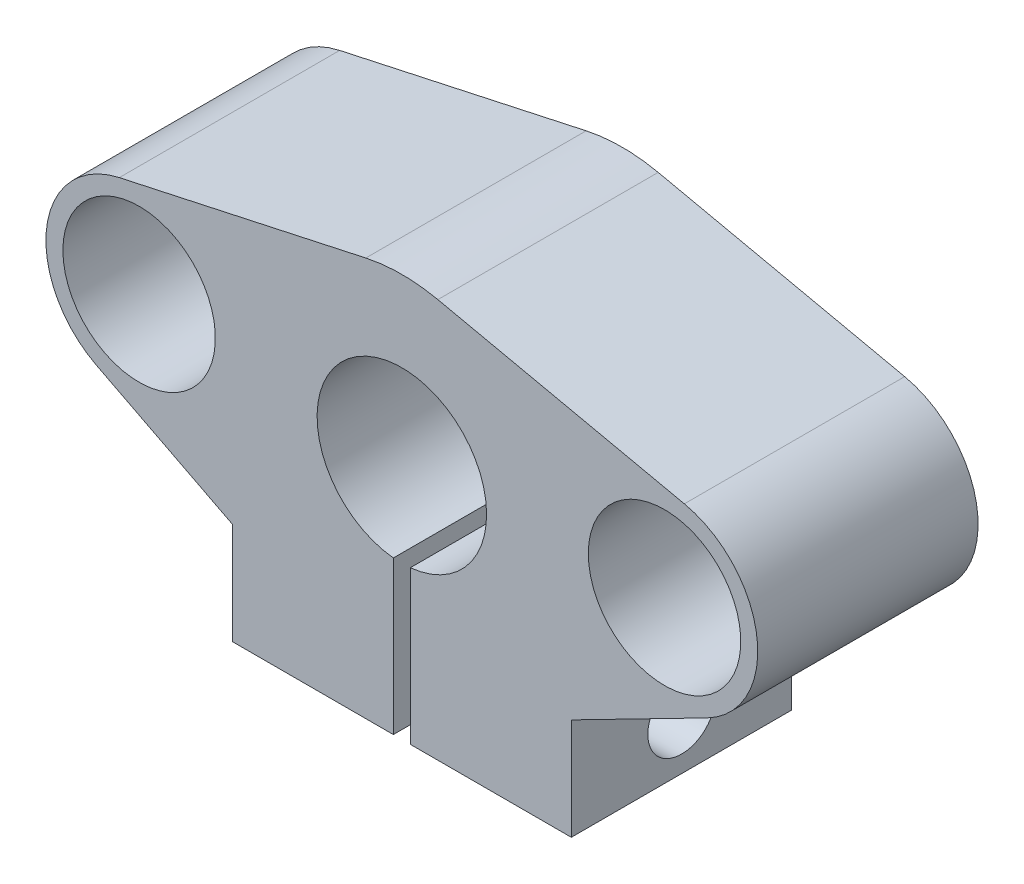
ISO-10303-21;
HEADER;
FILE_DESCRIPTION(('STEP AP214'),'2;1');
FILE_NAME('part.step','',(''),(''),'','','');
FILE_SCHEMA(('AUTOMOTIVE_DESIGN { 1 0 10303 214 1 1 1 1 }'));
ENDSEC;
DATA;
#1=APPLICATION_CONTEXT('core data for automotive mechanical design processes');
#2=APPLICATION_PROTOCOL_DEFINITION('international standard','automotive_design',2000,#1);
#3=PRODUCT_CONTEXT('',#1,'mechanical');
#4=PRODUCT('Part','Part','',(#3));
#5=PRODUCT_RELATED_PRODUCT_CATEGORY('part','',(#4));
#6=PRODUCT_DEFINITION_FORMATION('','',#4);
#7=PRODUCT_DEFINITION_CONTEXT('part definition',#1,'design');
#8=PRODUCT_DEFINITION('design','',#6,#7);
#9=PRODUCT_DEFINITION_SHAPE('','',#8);
#10=(LENGTH_UNIT() NAMED_UNIT(*) SI_UNIT(.MILLI.,.METRE.));
#11=(NAMED_UNIT(*) PLANE_ANGLE_UNIT() SI_UNIT($,.RADIAN.));
#12=(NAMED_UNIT(*) SI_UNIT($,.STERADIAN.) SOLID_ANGLE_UNIT());
#13=UNCERTAINTY_MEASURE_WITH_UNIT(LENGTH_MEASURE(1.E-05),#10,'distance_accuracy_value','');
#14=(GEOMETRIC_REPRESENTATION_CONTEXT(3) GLOBAL_UNCERTAINTY_ASSIGNED_CONTEXT((#13)) GLOBAL_UNIT_ASSIGNED_CONTEXT((#10,
#11,#12)) REPRESENTATION_CONTEXT('',''));
#15=CARTESIAN_POINT('',(0.,0.,0.));
#16=DIRECTION('',(0.,0.,1.));
#17=DIRECTION('',(1.,0.,0.));
#18=AXIS2_PLACEMENT_3D('',#15,#16,#17);
#19=CARTESIAN_POINT('',(0.,-12.,13.));
#20=DIRECTION('',(0.,1.,0.));
#21=DIRECTION('',(0.,0.,1.));
#22=AXIS2_PLACEMENT_3D('',#19,#20,#21);
#23=PLANE('',#22);
#24=DIRECTION('',(1.,0.,0.));
#25=VECTOR('',#24,1.);
#26=CARTESIAN_POINT('',(0.,-12.,0.));
#27=LINE('',#26,#25);
#28=CARTESIAN_POINT('',(-9.9999810136796,-12.,0.));
#29=VERTEX_POINT('',#28);
#30=CARTESIAN_POINT('',(-0.5,-12.,0.));
#31=VERTEX_POINT('',#30);
#32=EDGE_CURVE('E165',#29,#31,#27,.T.);
#33=ORIENTED_EDGE('',*,*,#32,.T.);
#34=DIRECTION('',(0.,0.,-1.));
#35=VECTOR('',#34,1.);
#36=CARTESIAN_POINT('',(-0.5,-12.,13.));
#37=LINE('',#36,#35);
#38=CARTESIAN_POINT('',(-0.5,-12.,13.));
#39=VERTEX_POINT('',#38);
#40=EDGE_CURVE('E158',#39,#31,#37,.T.);
#41=ORIENTED_EDGE('',*,*,#40,.F.);
#42=DIRECTION('',(1.,0.,0.));
#43=VECTOR('',#42,1.);
#44=CARTESIAN_POINT('',(0.,-12.,13.));
#45=LINE('',#44,#43);
#46=CARTESIAN_POINT('',(-9.9999810136796,-12.,13.));
#47=VERTEX_POINT('',#46);
#48=EDGE_CURVE('E265',#47,#39,#45,.T.);
#49=ORIENTED_EDGE('',*,*,#48,.F.);
#50=DIRECTION('',(0.,0.,-1.));
#51=VECTOR('',#50,1.);
#52=CARTESIAN_POINT('',(-9.9999810136796,-12.,13.));
#53=LINE('',#52,#51);
#54=EDGE_CURVE('E203',#47,#29,#53,.T.);
#55=ORIENTED_EDGE('',*,*,#54,.T.);
#56=EDGE_LOOP('',(#33,#41,#49,#55));
#57=FACE_BOUND('',#56,.T.);
#58=ADVANCED_FACE('F39',(#57),#23,.F.);
#59=CARTESIAN_POINT('',(21.,-8.999981481112,6.48790074393446));
#60=DIRECTION('',(-1.,0.,0.));
#61=DIRECTION('',(0.,0.,1.));
#62=AXIS2_PLACEMENT_3D('',#59,#60,#61);
#63=CYLINDRICAL_SURFACE('',#62,2.);
#64=CARTESIAN_POINT('',(-0.5,-8.999981481112,6.48790074393446));
#65=DIRECTION('',(-1.,0.,0.));
#66=DIRECTION('',(0.,0.,1.));
#67=AXIS2_PLACEMENT_3D('',#64,#65,#66);
#68=CIRCLE('',#67,2.);
#69=CARTESIAN_POINT('',(-0.500000000000001,-8.999981481112,8.48790074393446));
#70=VERTEX_POINT('',#69);
#71=EDGE_CURVE('E222',#70,#70,#68,.F.);
#72=ORIENTED_EDGE('',*,*,#71,.T.);
#73=EDGE_LOOP('',(#72));
#74=FACE_BOUND('',#73,.T.);
#75=CARTESIAN_POINT('',(-9.9999810136796,-8.999981481112,6.48790074393446));
#76=DIRECTION('',(-1.,0.,0.));
#77=DIRECTION('',(0.,0.,1.));
#78=AXIS2_PLACEMENT_3D('',#75,#76,#77);
#79=CIRCLE('',#78,2.);
#80=CARTESIAN_POINT('',(-9.9999810136796,-8.999981481112,8.48790074393446));
#81=VERTEX_POINT('',#80);
#82=EDGE_CURVE('E217',#81,#81,#79,.T.);
#83=ORIENTED_EDGE('',*,*,#82,.T.);
#84=EDGE_LOOP('',(#83));
#85=FACE_BOUND('',#84,.T.);
#86=ADVANCED_FACE('F305',(#74,#85),#63,.F.);
#87=CARTESIAN_POINT('',(-2.49220840305511,11.4579205999851,13.));
#88=DIRECTION('',(0.212540074655527,-0.977152350795629,0.));
#89=DIRECTION('',(0.977152350795629,0.212540074655527,0.));
#90=AXIS2_PLACEMENT_3D('',#87,#88,#89);
#91=PLANE('',#90);
#92=DIRECTION('',(-0.977152350795629,-0.212540074655527,0.));
#93=VECTOR('',#92,1.);
#94=CARTESIAN_POINT('',(-2.49220840305511,11.4579205999851,13.));
#95=LINE('',#94,#93);
#96=CARTESIAN_POINT('',(-2.12540074655527,11.5377048082851,13.));
#97=VERTEX_POINT('',#96);
#98=CARTESIAN_POINT('',(-16.6689704106054,8.37433792937596,13.));
#99=VERTEX_POINT('',#98);
#100=EDGE_CURVE('E190',#97,#99,#95,.T.);
#101=ORIENTED_EDGE('',*,*,#100,.F.);
#102=DIRECTION('',(0.,0.,-1.));
#103=VECTOR('',#102,1.);
#104=CARTESIAN_POINT('',(-2.12540074655527,11.5377048082851,0.));
#105=LINE('',#104,#103);
#106=CARTESIAN_POINT('',(-2.12540074655527,11.5377048082851,0.));
#107=VERTEX_POINT('',#106);
#108=EDGE_CURVE('E212',#97,#107,#105,.T.);
#109=ORIENTED_EDGE('',*,*,#108,.T.);
#110=DIRECTION('',(-0.977152350795629,-0.212540074655527,0.));
#111=VECTOR('',#110,1.);
#112=CARTESIAN_POINT('',(-2.49220840305511,11.4579205999851,0.));
#113=LINE('',#112,#111);
#114=CARTESIAN_POINT('',(-16.6689704106054,8.37433792937596,0.));
#115=VERTEX_POINT('',#114);
#116=EDGE_CURVE('E216',#107,#115,#113,.T.);
#117=ORIENTED_EDGE('',*,*,#116,.T.);
#118=DIRECTION('',(0.,0.,-1.));
#119=VECTOR('',#118,1.);
#120=CARTESIAN_POINT('',(-16.6689704106054,8.37433792937596,13.));
#121=LINE('',#120,#119);
#122=EDGE_CURVE('E209',#99,#115,#121,.T.);
#123=ORIENTED_EDGE('',*,*,#122,.F.);
#124=EDGE_LOOP('',(#101,#109,#117,#123));
#125=FACE_BOUND('',#124,.T.);
#126=ADVANCED_FACE('F231',(#125),#91,.F.);
#127=CARTESIAN_POINT('',(-15.5,3.,13.));
#128=DIRECTION('',(0.,0.,-1.));
#129=DIRECTION('',(-1.,0.,0.));
#130=AXIS2_PLACEMENT_3D('',#127,#128,#129);
#131=CYLINDRICAL_SURFACE('',#130,5.5);
#132=CARTESIAN_POINT('',(-15.5,3.,0.));
#133=DIRECTION('',(0.,0.,1.));
#134=DIRECTION('',(1.,0.,0.));
#135=AXIS2_PLACEMENT_3D('',#132,#133,#134);
#136=CIRCLE('',#135,5.5);
#137=CARTESIAN_POINT('',(-18.0089661298433,-1.89439362529199,0.));
#138=VERTEX_POINT('',#137);
#139=EDGE_CURVE('E238',#115,#138,#136,.T.);
#140=ORIENTED_EDGE('',*,*,#139,.T.);
#141=DIRECTION('',(0.,0.,-1.));
#142=VECTOR('',#141,1.);
#143=CARTESIAN_POINT('',(-18.0089661298433,-1.89439362529199,13.));
#144=LINE('',#143,#142);
#145=CARTESIAN_POINT('',(-18.0089661298433,-1.89439362529199,13.));
#146=VERTEX_POINT('',#145);
#147=EDGE_CURVE('E207',#146,#138,#144,.T.);
#148=ORIENTED_EDGE('',*,*,#147,.F.);
#149=CARTESIAN_POINT('',(-15.5,3.,13.));
#150=DIRECTION('',(0.,0.,1.));
#151=DIRECTION('',(1.,0.,0.));
#152=AXIS2_PLACEMENT_3D('',#149,#150,#151);
#153=CIRCLE('',#152,5.5);
#154=EDGE_CURVE('E255',#99,#146,#153,.T.);
#155=ORIENTED_EDGE('',*,*,#154,.F.);
#156=ORIENTED_EDGE('',*,*,#122,.T.);
#157=EDGE_LOOP('',(#140,#148,#155,#156));
#158=FACE_BOUND('',#157,.T.);
#159=ADVANCED_FACE('F254',(#158),#131,.T.);
#160=CARTESIAN_POINT('',(-4.51661960537823,-8.81084600604487,13.));
#161=DIRECTION('',(-0.456175659971517,-0.88988975005309,0.));
#162=DIRECTION('',(0.88988975005309,-0.456175659971517,0.));
#163=AXIS2_PLACEMENT_3D('',#160,#161,#162);
#164=PLANE('',#163);
#165=DIRECTION('',(-0.88988975005309,0.456175659971517,0.));
#166=VECTOR('',#165,1.);
#167=CARTESIAN_POINT('',(-4.51661960537823,-8.81084600604487,0.));
#168=LINE('',#167,#166);
#169=CARTESIAN_POINT('',(-9.9999810136796,-5.999962962224,0.));
#170=VERTEX_POINT('',#169);
#171=EDGE_CURVE('E170',#170,#138,#168,.T.);
#172=ORIENTED_EDGE('',*,*,#171,.F.);
#173=DIRECTION('',(0.,0.,-1.));
#174=VECTOR('',#173,1.);
#175=CARTESIAN_POINT('',(-9.9999810136796,-5.999962962224,13.));
#176=LINE('',#175,#174);
#177=CARTESIAN_POINT('',(-9.9999810136796,-5.999962962224,13.));
#178=VERTEX_POINT('',#177);
#179=EDGE_CURVE('E205',#178,#170,#176,.T.);
#180=ORIENTED_EDGE('',*,*,#179,.F.);
#181=DIRECTION('',(-0.88988975005309,0.456175659971517,0.));
#182=VECTOR('',#181,1.);
#183=CARTESIAN_POINT('',(-4.51661960537823,-8.81084600604487,13.));
#184=LINE('',#183,#182);
#185=EDGE_CURVE('E251',#178,#146,#184,.T.);
#186=ORIENTED_EDGE('',*,*,#185,.T.);
#187=ORIENTED_EDGE('',*,*,#147,.T.);
#188=EDGE_LOOP('',(#172,#180,#186,#187));
#189=FACE_BOUND('',#188,.T.);
#190=ADVANCED_FACE('F247',(#189),#164,.T.);
#191=CARTESIAN_POINT('',(-9.9999810136796,0.,13.));
#192=DIRECTION('',(-1.,0.,0.));
#193=DIRECTION('',(0.,0.,1.));
#194=AXIS2_PLACEMENT_3D('',#191,#192,#193);
#195=PLANE('',#194);
#196=ORIENTED_EDGE('',*,*,#82,.F.);
#197=EDGE_LOOP('',(#196));
#198=FACE_BOUND('',#197,.T.);
#199=DIRECTION('',(0.,1.,0.));
#200=VECTOR('',#199,1.);
#201=CARTESIAN_POINT('',(-9.9999810136796,0.,0.));
#202=LINE('',#201,#200);
#203=EDGE_CURVE('E166',#29,#170,#202,.T.);
#204=ORIENTED_EDGE('',*,*,#203,.F.);
#205=ORIENTED_EDGE('',*,*,#54,.F.);
#206=DIRECTION('',(0.,1.,0.));
#207=VECTOR('',#206,1.);
#208=CARTESIAN_POINT('',(-9.9999810136796,0.,13.));
#209=LINE('',#208,#207);
#210=EDGE_CURVE('E258',#47,#178,#209,.T.);
#211=ORIENTED_EDGE('',*,*,#210,.T.);
#212=ORIENTED_EDGE('',*,*,#179,.T.);
#213=EDGE_LOOP('',(#204,#205,#211,#212));
#214=FACE_BOUND('',#213,.T.);
#215=ADVANCED_FACE('F307',(#198,#214),#195,.T.);
#216=CARTESIAN_POINT('',(0.5,-12.,13.));
#217=VERTEX_POINT('',#216);
#218=CARTESIAN_POINT('',(9.9999810136796,-12.,13.));
#219=VERTEX_POINT('',#218);
#220=EDGE_CURVE('E157',#217,#219,#45,.T.);
#221=ORIENTED_EDGE('',*,*,#220,.F.);
#222=DIRECTION('',(0.,0.,1.));
#223=VECTOR('',#222,1.);
#224=CARTESIAN_POINT('',(0.5,-12.,13.));
#225=LINE('',#224,#223);
#226=CARTESIAN_POINT('',(0.499999999999999,-12.,0.));
#227=VERTEX_POINT('',#226);
#228=EDGE_CURVE('E141',#227,#217,#225,.T.);
#229=ORIENTED_EDGE('',*,*,#228,.F.);
#230=CARTESIAN_POINT('',(9.9999810136796,-12.,0.));
#231=VERTEX_POINT('',#230);
#232=EDGE_CURVE('E155',#227,#231,#27,.T.);
#233=ORIENTED_EDGE('',*,*,#232,.T.);
#234=DIRECTION('',(0.,0.,-1.));
#235=VECTOR('',#234,1.);
#236=CARTESIAN_POINT('',(9.9999810136796,-12.,13.));
#237=LINE('',#236,#235);
#238=EDGE_CURVE('E201',#219,#231,#237,.T.);
#239=ORIENTED_EDGE('',*,*,#238,.F.);
#240=EDGE_LOOP('',(#221,#229,#233,#239));
#241=FACE_BOUND('',#240,.T.);
#242=ADVANCED_FACE('F153',(#241),#23,.F.);
#243=CARTESIAN_POINT('',(9.9999810136796,0.,13.));
#244=DIRECTION('',(-1.,0.,0.));
#245=DIRECTION('',(0.,0.,1.));
#246=AXIS2_PLACEMENT_3D('',#243,#244,#245);
#247=PLANE('',#246);
#248=CARTESIAN_POINT('',(9.9999810136796,-8.999981481112,6.48790074393446));
#249=DIRECTION('',(-1.,0.,0.));
#250=DIRECTION('',(0.,0.,1.));
#251=AXIS2_PLACEMENT_3D('',#248,#249,#250);
#252=CIRCLE('',#251,2.);
#253=CARTESIAN_POINT('',(9.9999810136796,-8.999981481112,8.48790074393446));
#254=VERTEX_POINT('',#253);
#255=EDGE_CURVE('E213',#254,#254,#252,.T.);
#256=ORIENTED_EDGE('',*,*,#255,.T.);
#257=EDGE_LOOP('',(#256));
#258=FACE_BOUND('',#257,.T.);
#259=DIRECTION('',(0.,1.,0.));
#260=VECTOR('',#259,1.);
#261=CARTESIAN_POINT('',(9.9999810136796,0.,0.));
#262=LINE('',#261,#260);
#263=CARTESIAN_POINT('',(9.9999810136796,-5.999962962224,0.));
#264=VERTEX_POINT('',#263);
#265=EDGE_CURVE('E164',#231,#264,#262,.T.);
#266=ORIENTED_EDGE('',*,*,#265,.T.);
#267=DIRECTION('',(0.,0.,-1.));
#268=VECTOR('',#267,1.);
#269=CARTESIAN_POINT('',(9.9999810136796,-5.999962962224,13.));
#270=LINE('',#269,#268);
#271=CARTESIAN_POINT('',(9.9999810136796,-5.999962962224,13.));
#272=VERTEX_POINT('',#271);
#273=EDGE_CURVE('E198',#272,#264,#270,.T.);
#274=ORIENTED_EDGE('',*,*,#273,.F.);
#275=DIRECTION('',(0.,1.,0.));
#276=VECTOR('',#275,1.);
#277=CARTESIAN_POINT('',(9.9999810136796,0.,13.));
#278=LINE('',#277,#276);
#279=EDGE_CURVE('E268',#219,#272,#278,.T.);
#280=ORIENTED_EDGE('',*,*,#279,.F.);
#281=ORIENTED_EDGE('',*,*,#238,.T.);
#282=EDGE_LOOP('',(#266,#274,#280,#281));
#283=FACE_BOUND('',#282,.T.);
#284=ADVANCED_FACE('F339',(#258,#283),#247,.F.);
#285=CARTESIAN_POINT('',(4.51661960537823,-8.81084600604487,13.));
#286=DIRECTION('',(-0.456175659971517,0.88988975005309,0.));
#287=DIRECTION('',(-0.88988975005309,-0.456175659971517,0.));
#288=AXIS2_PLACEMENT_3D('',#285,#286,#287);
#289=PLANE('',#288);
#290=DIRECTION('',(0.88988975005309,0.456175659971517,0.));
#291=VECTOR('',#290,1.);
#292=CARTESIAN_POINT('',(4.51661960537823,-8.81084600604487,0.));
#293=LINE('',#292,#291);
#294=CARTESIAN_POINT('',(18.0089661298433,-1.894393625292,0.));
#295=VERTEX_POINT('',#294);
#296=EDGE_CURVE('E175',#264,#295,#293,.T.);
#297=ORIENTED_EDGE('',*,*,#296,.T.);
#298=DIRECTION('',(0.,0.,-1.));
#299=VECTOR('',#298,1.);
#300=CARTESIAN_POINT('',(18.0089661298433,-1.894393625292,13.));
#301=LINE('',#300,#299);
#302=CARTESIAN_POINT('',(18.0089661298433,-1.894393625292,13.));
#303=VERTEX_POINT('',#302);
#304=EDGE_CURVE('E194',#303,#295,#301,.T.);
#305=ORIENTED_EDGE('',*,*,#304,.F.);
#306=DIRECTION('',(0.88988975005309,0.456175659971517,0.));
#307=VECTOR('',#306,1.);
#308=CARTESIAN_POINT('',(4.51661960537823,-8.81084600604487,13.));
#309=LINE('',#308,#307);
#310=EDGE_CURVE('E270',#272,#303,#309,.T.);
#311=ORIENTED_EDGE('',*,*,#310,.F.);
#312=ORIENTED_EDGE('',*,*,#273,.T.);
#313=EDGE_LOOP('',(#297,#305,#311,#312));
#314=FACE_BOUND('',#313,.T.);
#315=ADVANCED_FACE('F342',(#314),#289,.F.);
#316=CARTESIAN_POINT('',(15.5,3.,13.));
#317=DIRECTION('',(0.,0.,-1.));
#318=DIRECTION('',(-1.,0.,0.));
#319=AXIS2_PLACEMENT_3D('',#316,#317,#318);
#320=CYLINDRICAL_SURFACE('',#319,5.5);
#321=CARTESIAN_POINT('',(15.5,3.,0.));
#322=DIRECTION('',(0.,0.,1.));
#323=DIRECTION('',(1.,0.,0.));
#324=AXIS2_PLACEMENT_3D('',#321,#322,#323);
#325=CIRCLE('',#324,5.5);
#326=CARTESIAN_POINT('',(16.6689704106054,8.37433792937595,0.));
#327=VERTEX_POINT('',#326);
#328=EDGE_CURVE('E177',#295,#327,#325,.T.);
#329=ORIENTED_EDGE('',*,*,#328,.T.);
#330=DIRECTION('',(0.,0.,-1.));
#331=VECTOR('',#330,1.);
#332=CARTESIAN_POINT('',(16.6689704106054,8.37433792937595,13.));
#333=LINE('',#332,#331);
#334=CARTESIAN_POINT('',(16.6689704106054,8.37433792937595,13.));
#335=VERTEX_POINT('',#334);
#336=EDGE_CURVE('E191',#335,#327,#333,.T.);
#337=ORIENTED_EDGE('',*,*,#336,.F.);
#338=CARTESIAN_POINT('',(15.5,3.,13.));
#339=DIRECTION('',(0.,0.,1.));
#340=DIRECTION('',(1.,0.,0.));
#341=AXIS2_PLACEMENT_3D('',#338,#339,#340);
#342=CIRCLE('',#341,5.5);
#343=EDGE_CURVE('E272',#303,#335,#342,.T.);
#344=ORIENTED_EDGE('',*,*,#343,.F.);
#345=ORIENTED_EDGE('',*,*,#304,.T.);
#346=EDGE_LOOP('',(#329,#337,#344,#345));
#347=FACE_BOUND('',#346,.T.);
#348=ADVANCED_FACE('F352',(#347),#320,.T.);
#349=CARTESIAN_POINT('',(15.5,3.,13.));
#350=DIRECTION('',(0.,0.,-1.));
#351=DIRECTION('',(-1.,0.,0.));
#352=AXIS2_PLACEMENT_3D('',#349,#350,#351);
#353=CYLINDRICAL_SURFACE('',#352,4.4984520678429);
#354=CARTESIAN_POINT('',(15.5,3.,13.));
#355=DIRECTION('',(0.,0.,1.));
#356=DIRECTION('',(1.,0.,0.));
#357=AXIS2_PLACEMENT_3D('',#354,#355,#356);
#358=CIRCLE('',#357,4.4984520678429);
#359=CARTESIAN_POINT('',(11.0015479321571,3.,13.));
#360=VERTEX_POINT('',#359);
#361=EDGE_CURVE('E279',#360,#360,#358,.T.);
#362=CARTESIAN_POINT('',(15.5,3.,0.));
#363=DIRECTION('',(0.,0.,1.));
#364=DIRECTION('',(1.,0.,0.));
#365=AXIS2_PLACEMENT_3D('',#362,#363,#364);
#366=CIRCLE('',#365,4.4984520678429);
#367=CARTESIAN_POINT('',(11.0015479321571,3.,0.));
#368=VERTEX_POINT('',#367);
#369=EDGE_CURVE('E185',#368,#368,#366,.T.);
#370=CARTESIAN_POINT('',(11.0015479321571,3.,13.));
#371=CARTESIAN_POINT('',(11.0015479321571,3.,12.8645833333333));
#372=CARTESIAN_POINT('',(11.0015479321571,3.,12.7291666666667));
#373=CARTESIAN_POINT('',(11.0015479321571,3.,12.4583333333333));
#374=CARTESIAN_POINT('',(11.0015479321571,3.,12.3229166666667));
#375=CARTESIAN_POINT('',(11.0015479321571,3.,12.0520833333333));
#376=CARTESIAN_POINT('',(11.0015479321571,3.,11.9166666666667));
#377=CARTESIAN_POINT('',(11.0015479321571,3.,11.6458333333333));
#378=CARTESIAN_POINT('',(11.0015479321571,3.,11.5104166666667));
#379=CARTESIAN_POINT('',(11.0015479321571,3.,11.2395833333333));
#380=CARTESIAN_POINT('',(11.0015479321571,3.,11.1041666666667));
#381=CARTESIAN_POINT('',(11.0015479321571,3.,10.8333333333333));
#382=CARTESIAN_POINT('',(11.0015479321571,3.,10.6979166666667));
#383=CARTESIAN_POINT('',(11.0015479321571,3.,10.4270833333333));
#384=CARTESIAN_POINT('',(11.0015479321571,3.,10.2916666666667));
#385=CARTESIAN_POINT('',(11.0015479321571,3.,10.0208333333333));
#386=CARTESIAN_POINT('',(11.0015479321571,3.,9.88541666666667));
#387=CARTESIAN_POINT('',(11.0015479321571,3.,9.61458333333333));
#388=CARTESIAN_POINT('',(11.0015479321571,3.,9.47916666666667));
#389=CARTESIAN_POINT('',(11.0015479321571,3.,9.20833333333333));
#390=CARTESIAN_POINT('',(11.0015479321571,3.,9.07291666666667));
#391=CARTESIAN_POINT('',(11.0015479321571,3.,8.80208333333333));
#392=CARTESIAN_POINT('',(11.0015479321571,3.,8.66666666666667));
#393=CARTESIAN_POINT('',(11.0015479321571,3.,8.39583333333333));
#394=CARTESIAN_POINT('',(11.0015479321571,3.,8.26041666666667));
#395=CARTESIAN_POINT('',(11.0015479321571,3.,7.98958333333333));
#396=CARTESIAN_POINT('',(11.0015479321571,3.,7.85416666666667));
#397=CARTESIAN_POINT('',(11.0015479321571,3.,7.58333333333333));
#398=CARTESIAN_POINT('',(11.0015479321571,3.,7.44791666666667));
#399=CARTESIAN_POINT('',(11.0015479321571,3.,7.17708333333333));
#400=CARTESIAN_POINT('',(11.0015479321571,3.,7.04166666666667));
#401=CARTESIAN_POINT('',(11.0015479321571,3.,6.77083333333333));
#402=CARTESIAN_POINT('',(11.0015479321571,3.,6.63541666666667));
#403=CARTESIAN_POINT('',(11.0015479321571,3.,6.36458333333333));
#404=CARTESIAN_POINT('',(11.0015479321571,3.,6.22916666666667));
#405=CARTESIAN_POINT('',(11.0015479321571,3.,5.95833333333333));
#406=CARTESIAN_POINT('',(11.0015479321571,3.,5.82291666666667));
#407=CARTESIAN_POINT('',(11.0015479321571,3.,5.55208333333333));
#408=CARTESIAN_POINT('',(11.0015479321571,3.,5.41666666666667));
#409=CARTESIAN_POINT('',(11.0015479321571,3.,5.14583333333333));
#410=CARTESIAN_POINT('',(11.0015479321571,3.,5.01041666666667));
#411=CARTESIAN_POINT('',(11.0015479321571,3.,4.73958333333333));
#412=CARTESIAN_POINT('',(11.0015479321571,3.,4.60416666666667));
#413=CARTESIAN_POINT('',(11.0015479321571,3.,4.33333333333333));
#414=CARTESIAN_POINT('',(11.0015479321571,3.,4.19791666666667));
#415=CARTESIAN_POINT('',(11.0015479321571,3.,3.92708333333333));
#416=CARTESIAN_POINT('',(11.0015479321571,3.,3.79166666666667));
#417=CARTESIAN_POINT('',(11.0015479321571,3.,3.52083333333333));
#418=CARTESIAN_POINT('',(11.0015479321571,3.,3.38541666666667));
#419=CARTESIAN_POINT('',(11.0015479321571,3.,3.11458333333333));
#420=CARTESIAN_POINT('',(11.0015479321571,3.,2.97916666666667));
#421=CARTESIAN_POINT('',(11.0015479321571,3.,2.70833333333333));
#422=CARTESIAN_POINT('',(11.0015479321571,3.,2.57291666666667));
#423=CARTESIAN_POINT('',(11.0015479321571,3.,2.30208333333333));
#424=CARTESIAN_POINT('',(11.0015479321571,3.,2.16666666666667));
#425=CARTESIAN_POINT('',(11.0015479321571,3.,1.89583333333333));
#426=CARTESIAN_POINT('',(11.0015479321571,3.,1.76041666666667));
#427=CARTESIAN_POINT('',(11.0015479321571,3.,1.48958333333333));
#428=CARTESIAN_POINT('',(11.0015479321571,3.,1.35416666666667));
#429=CARTESIAN_POINT('',(11.0015479321571,3.,1.08333333333333));
#430=CARTESIAN_POINT('',(11.0015479321571,3.,0.947916666666667));
#431=CARTESIAN_POINT('',(11.0015479321571,3.,0.677083333333334));
#432=CARTESIAN_POINT('',(11.0015479321571,3.,0.541666666666667));
#433=CARTESIAN_POINT('',(11.0015479321571,3.,0.270833333333334));
#434=CARTESIAN_POINT('',(11.0015479321571,3.,0.135416666666667));
#435=CARTESIAN_POINT('',(11.0015479321571,3.,0.));
#436=B_SPLINE_CURVE_WITH_KNOTS('',3,(#370,#371,#372,#373,#374,#375,#376,#377,#378,#379,#380,
#381,#382,#383,#384,#385,#386,#387,#388,#389,#390,#391,#392,#393,#394,#395,#396,#397,#398,#399,
#400,#401,#402,#403,#404,#405,#406,#407,#408,#409,#410,#411,#412,#413,#414,#415,#416,#417,#418,
#419,#420,#421,#422,#423,#424,#425,#426,#427,#428,#429,#430,#431,#432,#433,#434,#435),
.UNSPECIFIED.,.F.,.F.,(4,2,2,2,2,2,2,2,2,2,2,2,2,2,2,2,2,2,2,2,2,2,2,2,2,2,2,2,2,2,2,2,4),(0.,
0.406249999999999,0.812499999999999,1.21875,1.625,2.03125,2.4375,2.84375,3.25,3.65625,4.0625,
4.46875,4.875,5.28125,5.6875,6.09375,6.5,6.90625,7.3125,7.71875,8.125,8.53125,8.9375,9.34375,
9.75,10.15625,10.5625,10.96875,11.375,11.78125,12.1875,12.59375,13.),.UNSPECIFIED.);
#437=EDGE_CURVE('BSEAM434',#360,#368,#436,.T.);
#438=ORIENTED_EDGE('',*,*,#361,.T.);
#439=ORIENTED_EDGE('',*,*,#369,.F.);
#440=ORIENTED_EDGE('',*,*,#437,.T.);
#441=ORIENTED_EDGE('',*,*,#437,.F.);
#442=EDGE_LOOP('',(#438,#440,#439,#441));
#443=FACE_BOUND('',#442,.T.);
#444=ADVANCED_FACE('F434',(#443),#353,.F.);
#445=CARTESIAN_POINT('',(-15.5,3.,13.));
#446=DIRECTION('',(0.,0.,-1.));
#447=DIRECTION('',(-1.,0.,0.));
#448=AXIS2_PLACEMENT_3D('',#445,#446,#447);
#449=CYLINDRICAL_SURFACE('',#448,4.4984520678429);
#450=CARTESIAN_POINT('',(-15.5,3.,13.));
#451=DIRECTION('',(0.,0.,1.));
#452=DIRECTION('',(1.,0.,0.));
#453=AXIS2_PLACEMENT_3D('',#450,#451,#452);
#454=CIRCLE('',#453,4.4984520678429);
#455=CARTESIAN_POINT('',(-19.9984520678429,3.,13.));
#456=VERTEX_POINT('',#455);
#457=EDGE_CURVE('E277',#456,#456,#454,.F.);
#458=CARTESIAN_POINT('',(-15.5,3.,0.));
#459=DIRECTION('',(0.,0.,1.));
#460=DIRECTION('',(1.,0.,0.));
#461=AXIS2_PLACEMENT_3D('',#458,#459,#460);
#462=CIRCLE('',#461,4.4984520678429);
#463=CARTESIAN_POINT('',(-19.9984520678429,3.,0.));
#464=VERTEX_POINT('',#463);
#465=EDGE_CURVE('E182',#464,#464,#462,.F.);
#466=CARTESIAN_POINT('',(-19.9984520678429,3.,13.));
#467=CARTESIAN_POINT('',(-19.9984520678429,3.,12.8645833333333));
#468=CARTESIAN_POINT('',(-19.9984520678429,3.,12.7291666666667));
#469=CARTESIAN_POINT('',(-19.9984520678429,3.,12.4583333333333));
#470=CARTESIAN_POINT('',(-19.9984520678429,3.,12.3229166666667));
#471=CARTESIAN_POINT('',(-19.9984520678429,3.,12.0520833333333));
#472=CARTESIAN_POINT('',(-19.9984520678429,3.,11.9166666666667));
#473=CARTESIAN_POINT('',(-19.9984520678429,3.,11.6458333333333));
#474=CARTESIAN_POINT('',(-19.9984520678429,3.,11.5104166666667));
#475=CARTESIAN_POINT('',(-19.9984520678429,3.,11.2395833333333));
#476=CARTESIAN_POINT('',(-19.9984520678429,3.,11.1041666666667));
#477=CARTESIAN_POINT('',(-19.9984520678429,3.,10.8333333333333));
#478=CARTESIAN_POINT('',(-19.9984520678429,3.,10.6979166666667));
#479=CARTESIAN_POINT('',(-19.9984520678429,3.,10.4270833333333));
#480=CARTESIAN_POINT('',(-19.9984520678429,3.,10.2916666666667));
#481=CARTESIAN_POINT('',(-19.9984520678429,3.,10.0208333333333));
#482=CARTESIAN_POINT('',(-19.9984520678429,3.,9.88541666666667));
#483=CARTESIAN_POINT('',(-19.9984520678429,3.,9.61458333333333));
#484=CARTESIAN_POINT('',(-19.9984520678429,3.,9.47916666666667));
#485=CARTESIAN_POINT('',(-19.9984520678429,3.,9.20833333333333));
#486=CARTESIAN_POINT('',(-19.9984520678429,3.,9.07291666666667));
#487=CARTESIAN_POINT('',(-19.9984520678429,3.,8.80208333333333));
#488=CARTESIAN_POINT('',(-19.9984520678429,3.,8.66666666666667));
#489=CARTESIAN_POINT('',(-19.9984520678429,3.,8.39583333333333));
#490=CARTESIAN_POINT('',(-19.9984520678429,3.,8.26041666666667));
#491=CARTESIAN_POINT('',(-19.9984520678429,3.,7.98958333333333));
#492=CARTESIAN_POINT('',(-19.9984520678429,3.,7.85416666666667));
#493=CARTESIAN_POINT('',(-19.9984520678429,3.,7.58333333333333));
#494=CARTESIAN_POINT('',(-19.9984520678429,3.,7.44791666666667));
#495=CARTESIAN_POINT('',(-19.9984520678429,3.,7.17708333333333));
#496=CARTESIAN_POINT('',(-19.9984520678429,3.,7.04166666666667));
#497=CARTESIAN_POINT('',(-19.9984520678429,3.,6.77083333333333));
#498=CARTESIAN_POINT('',(-19.9984520678429,3.,6.63541666666667));
#499=CARTESIAN_POINT('',(-19.9984520678429,3.,6.36458333333333));
#500=CARTESIAN_POINT('',(-19.9984520678429,3.,6.22916666666667));
#501=CARTESIAN_POINT('',(-19.9984520678429,3.,5.95833333333333));
#502=CARTESIAN_POINT('',(-19.9984520678429,3.,5.82291666666667));
#503=CARTESIAN_POINT('',(-19.9984520678429,3.,5.55208333333333));
#504=CARTESIAN_POINT('',(-19.9984520678429,3.,5.41666666666667));
#505=CARTESIAN_POINT('',(-19.9984520678429,3.,5.14583333333333));
#506=CARTESIAN_POINT('',(-19.9984520678429,3.,5.01041666666667));
#507=CARTESIAN_POINT('',(-19.9984520678429,3.,4.73958333333333));
#508=CARTESIAN_POINT('',(-19.9984520678429,3.,4.60416666666667));
#509=CARTESIAN_POINT('',(-19.9984520678429,3.,4.33333333333333));
#510=CARTESIAN_POINT('',(-19.9984520678429,3.,4.19791666666667));
#511=CARTESIAN_POINT('',(-19.9984520678429,3.,3.92708333333333));
#512=CARTESIAN_POINT('',(-19.9984520678429,3.,3.79166666666667));
#513=CARTESIAN_POINT('',(-19.9984520678429,3.,3.52083333333333));
#514=CARTESIAN_POINT('',(-19.9984520678429,3.,3.38541666666667));
#515=CARTESIAN_POINT('',(-19.9984520678429,3.,3.11458333333333));
#516=CARTESIAN_POINT('',(-19.9984520678429,3.,2.97916666666667));
#517=CARTESIAN_POINT('',(-19.9984520678429,3.,2.70833333333333));
#518=CARTESIAN_POINT('',(-19.9984520678429,3.,2.57291666666667));
#519=CARTESIAN_POINT('',(-19.9984520678429,3.,2.30208333333333));
#520=CARTESIAN_POINT('',(-19.9984520678429,3.,2.16666666666667));
#521=CARTESIAN_POINT('',(-19.9984520678429,3.,1.89583333333333));
#522=CARTESIAN_POINT('',(-19.9984520678429,3.,1.76041666666667));
#523=CARTESIAN_POINT('',(-19.9984520678429,3.,1.48958333333333));
#524=CARTESIAN_POINT('',(-19.9984520678429,3.,1.35416666666667));
#525=CARTESIAN_POINT('',(-19.9984520678429,3.,1.08333333333333));
#526=CARTESIAN_POINT('',(-19.9984520678429,3.,0.947916666666667));
#527=CARTESIAN_POINT('',(-19.9984520678429,3.,0.677083333333334));
#528=CARTESIAN_POINT('',(-19.9984520678429,3.,0.541666666666667));
#529=CARTESIAN_POINT('',(-19.9984520678429,3.,0.270833333333334));
#530=CARTESIAN_POINT('',(-19.9984520678429,3.,0.135416666666667));
#531=CARTESIAN_POINT('',(-19.9984520678429,3.,0.));
#532=B_SPLINE_CURVE_WITH_KNOTS('',3,(#466,#467,#468,#469,#470,#471,#472,#473,#474,#475,#476,
#477,#478,#479,#480,#481,#482,#483,#484,#485,#486,#487,#488,#489,#490,#491,#492,#493,#494,#495,
#496,#497,#498,#499,#500,#501,#502,#503,#504,#505,#506,#507,#508,#509,#510,#511,#512,#513,#514,
#515,#516,#517,#518,#519,#520,#521,#522,#523,#524,#525,#526,#527,#528,#529,#530,#531),
.UNSPECIFIED.,.F.,.F.,(4,2,2,2,2,2,2,2,2,2,2,2,2,2,2,2,2,2,2,2,2,2,2,2,2,2,2,2,2,2,2,2,4),(0.,
0.406249999999999,0.812499999999999,1.21875,1.625,2.03125,2.4375,2.84375,3.25,3.65625,4.0625,
4.46875,4.875,5.28125,5.6875,6.09375,6.5,6.90625,7.3125,7.71875,8.125,8.53125,8.9375,9.34375,
9.75,10.15625,10.5625,10.96875,11.375,11.78125,12.1875,12.59375,13.),.UNSPECIFIED.);
#533=EDGE_CURVE('BSEAM429',#456,#464,#532,.T.);
#534=ORIENTED_EDGE('',*,*,#457,.F.);
#535=ORIENTED_EDGE('',*,*,#465,.T.);
#536=ORIENTED_EDGE('',*,*,#533,.T.);
#537=ORIENTED_EDGE('',*,*,#533,.F.);
#538=EDGE_LOOP('',(#534,#536,#535,#537));
#539=FACE_BOUND('',#538,.T.);
#540=ADVANCED_FACE('F429',(#539),#449,.F.);
#541=CARTESIAN_POINT('',(2.49220840305511,11.4579205999851,13.));
#542=DIRECTION('',(0.212540074655526,0.977152350795629,0.));
#543=DIRECTION('',(-0.977152350795629,0.212540074655526,0.));
#544=AXIS2_PLACEMENT_3D('',#541,#542,#543);
#545=PLANE('',#544);
#546=DIRECTION('',(0.977152350795629,-0.212540074655527,0.));
#547=VECTOR('',#546,1.);
#548=CARTESIAN_POINT('',(2.49220840305511,11.4579205999851,0.));
#549=LINE('',#548,#547);
#550=CARTESIAN_POINT('',(2.12540074655526,11.5377048082851,0.));
#551=VERTEX_POINT('',#550);
#552=EDGE_CURVE('E180',#551,#327,#549,.T.);
#553=ORIENTED_EDGE('',*,*,#552,.F.);
#554=DIRECTION('',(0.,0.,-1.));
#555=VECTOR('',#554,1.);
#556=CARTESIAN_POINT('',(2.12540074655526,11.5377048082851,13.));
#557=LINE('',#556,#555);
#558=CARTESIAN_POINT('',(2.12540074655526,11.5377048082851,13.));
#559=VERTEX_POINT('',#558);
#560=EDGE_CURVE('E47',#551,#559,#557,.F.);
#561=ORIENTED_EDGE('',*,*,#560,.T.);
#562=DIRECTION('',(0.977152350795629,-0.212540074655527,0.));
#563=VECTOR('',#562,1.);
#564=CARTESIAN_POINT('',(2.49220840305511,11.4579205999851,13.));
#565=LINE('',#564,#563);
#566=EDGE_CURVE('E275',#559,#335,#565,.T.);
#567=ORIENTED_EDGE('',*,*,#566,.T.);
#568=ORIENTED_EDGE('',*,*,#336,.T.);
#569=EDGE_LOOP('',(#553,#561,#567,#568));
#570=FACE_BOUND('',#569,.T.);
#571=ADVANCED_FACE('F385',(#570),#545,.T.);
#572=CARTESIAN_POINT('',(0.,2.,13.));
#573=DIRECTION('',(0.,0.,-1.));
#574=DIRECTION('',(-1.,0.,0.));
#575=AXIS2_PLACEMENT_3D('',#572,#573,#574);
#576=CYLINDRICAL_SURFACE('',#575,5.);
#577=DIRECTION('',(0.,0.,-1.));
#578=VECTOR('',#577,1.);
#579=CARTESIAN_POINT('',(-0.5,-2.9749371855331,13.));
#580=LINE('',#579,#578);
#581=CARTESIAN_POINT('',(-0.499999999999999,-2.9749371855331,0.));
#582=VERTEX_POINT('',#581);
#583=CARTESIAN_POINT('',(-0.5,-2.9749371855331,13.));
#584=VERTEX_POINT('',#583);
#585=EDGE_CURVE('E225',#582,#584,#580,.F.);
#586=ORIENTED_EDGE('',*,*,#585,.F.);
#587=CARTESIAN_POINT('',(0.,2.,0.));
#588=DIRECTION('',(0.,0.,1.));
#589=DIRECTION('',(1.,0.,0.));
#590=AXIS2_PLACEMENT_3D('',#587,#588,#589);
#591=CIRCLE('',#590,5.);
#592=CARTESIAN_POINT('',(0.499999999999999,-2.9749371855331,0.));
#593=VERTEX_POINT('',#592);
#594=EDGE_CURVE('E188',#593,#582,#591,.T.);
#595=ORIENTED_EDGE('',*,*,#594,.F.);
#596=DIRECTION('',(0.,0.,-1.));
#597=VECTOR('',#596,1.);
#598=CARTESIAN_POINT('',(0.5,-2.9749371855331,13.));
#599=LINE('',#598,#597);
#600=CARTESIAN_POINT('',(0.5,-2.9749371855331,13.));
#601=VERTEX_POINT('',#600);
#602=EDGE_CURVE('E144',#601,#593,#599,.T.);
#603=ORIENTED_EDGE('',*,*,#602,.F.);
#604=CARTESIAN_POINT('',(0.,2.,13.));
#605=DIRECTION('',(0.,0.,1.));
#606=DIRECTION('',(1.,0.,0.));
#607=AXIS2_PLACEMENT_3D('',#604,#605,#606);
#608=CIRCLE('',#607,5.);
#609=EDGE_CURVE('E195',#601,#584,#608,.T.);
#610=ORIENTED_EDGE('',*,*,#609,.T.);
#611=EDGE_LOOP('',(#586,#595,#603,#610));
#612=FACE_BOUND('',#611,.T.);
#613=ADVANCED_FACE('F287',(#612),#576,.F.);
#614=CARTESIAN_POINT('',(0.,0.,13.));
#615=DIRECTION('',(0.,0.,1.));
#616=DIRECTION('',(1.,0.,0.));
#617=AXIS2_PLACEMENT_3D('',#614,#615,#616);
#618=PLANE('',#617);
#619=ORIENTED_EDGE('',*,*,#566,.F.);
#620=CARTESIAN_POINT('',(0.,1.76618130032877,13.));
#621=DIRECTION('',(0.,0.,1.));
#622=DIRECTION('',(1.,0.,0.));
#623=AXIS2_PLACEMENT_3D('',#620,#621,#622);
#624=CIRCLE('',#623,10.);
#625=EDGE_CURVE('E11',#559,#97,#624,.T.);
#626=ORIENTED_EDGE('',*,*,#625,.T.);
#627=ORIENTED_EDGE('',*,*,#100,.T.);
#628=ORIENTED_EDGE('',*,*,#154,.T.);
#629=ORIENTED_EDGE('',*,*,#185,.F.);
#630=ORIENTED_EDGE('',*,*,#210,.F.);
#631=ORIENTED_EDGE('',*,*,#48,.T.);
#632=DIRECTION('',(0.,-1.,0.));
#633=VECTOR('',#632,1.);
#634=CARTESIAN_POINT('',(-0.5,0.999999999999999,13.));
#635=LINE('',#634,#633);
#636=EDGE_CURVE('E221',#584,#39,#635,.T.);
#637=ORIENTED_EDGE('',*,*,#636,.F.);
#638=ORIENTED_EDGE('',*,*,#609,.F.);
#639=DIRECTION('',(0.,-1.,0.));
#640=VECTOR('',#639,1.);
#641=CARTESIAN_POINT('',(0.5,0.999999999999999,13.));
#642=LINE('',#641,#640);
#643=EDGE_CURVE('E148',#601,#217,#642,.T.);
#644=ORIENTED_EDGE('',*,*,#643,.T.);
#645=ORIENTED_EDGE('',*,*,#220,.T.);
#646=ORIENTED_EDGE('',*,*,#279,.T.);
#647=ORIENTED_EDGE('',*,*,#310,.T.);
#648=ORIENTED_EDGE('',*,*,#343,.T.);
#649=EDGE_LOOP('',(#619,#626,#627,#628,#629,#630,#631,#637,#638,#644,#645,#646,#647,#648));
#650=FACE_BOUND('',#649,.T.);
#651=ORIENTED_EDGE('',*,*,#457,.T.);
#652=EDGE_LOOP('',(#651));
#653=FACE_BOUND('',#652,.T.);
#654=ORIENTED_EDGE('',*,*,#361,.F.);
#655=EDGE_LOOP('',(#654));
#656=FACE_BOUND('',#655,.T.);
#657=ADVANCED_FACE('F289',(#650,#653,#656),#618,.T.);
#658=CARTESIAN_POINT('',(0.,0.,0.));
#659=DIRECTION('',(0.,0.,1.));
#660=DIRECTION('',(1.,0.,0.));
#661=AXIS2_PLACEMENT_3D('',#658,#659,#660);
#662=PLANE('',#661);
#663=ORIENTED_EDGE('',*,*,#116,.F.);
#664=CARTESIAN_POINT('',(0.,1.76618130032877,0.));
#665=DIRECTION('',(0.,0.,1.));
#666=DIRECTION('',(1.,0.,0.));
#667=AXIS2_PLACEMENT_3D('',#664,#665,#666);
#668=CIRCLE('',#667,10.);
#669=EDGE_CURVE('E61',#107,#551,#668,.F.);
#670=ORIENTED_EDGE('',*,*,#669,.T.);
#671=ORIENTED_EDGE('',*,*,#552,.T.);
#672=ORIENTED_EDGE('',*,*,#328,.F.);
#673=ORIENTED_EDGE('',*,*,#296,.F.);
#674=ORIENTED_EDGE('',*,*,#265,.F.);
#675=ORIENTED_EDGE('',*,*,#232,.F.);
#676=DIRECTION('',(0.,-1.,0.));
#677=VECTOR('',#676,1.);
#678=CARTESIAN_POINT('',(0.499999999999999,0.999999999999999,0.));
#679=LINE('',#678,#677);
#680=EDGE_CURVE('E137',#593,#227,#679,.T.);
#681=ORIENTED_EDGE('',*,*,#680,.F.);
#682=ORIENTED_EDGE('',*,*,#594,.T.);
#683=DIRECTION('',(0.,-1.,0.));
#684=VECTOR('',#683,1.);
#685=CARTESIAN_POINT('',(-0.499999999999999,0.999999999999999,0.));
#686=LINE('',#685,#684);
#687=EDGE_CURVE('E149',#582,#31,#686,.T.);
#688=ORIENTED_EDGE('',*,*,#687,.T.);
#689=ORIENTED_EDGE('',*,*,#32,.F.);
#690=ORIENTED_EDGE('',*,*,#203,.T.);
#691=ORIENTED_EDGE('',*,*,#171,.T.);
#692=ORIENTED_EDGE('',*,*,#139,.F.);
#693=EDGE_LOOP('',(#663,#670,#671,#672,#673,#674,#675,#681,#682,#688,#689,#690,#691,#692));
#694=FACE_BOUND('',#693,.T.);
#695=ORIENTED_EDGE('',*,*,#465,.F.);
#696=EDGE_LOOP('',(#695));
#697=FACE_BOUND('',#696,.T.);
#698=ORIENTED_EDGE('',*,*,#369,.T.);
#699=EDGE_LOOP('',(#698));
#700=FACE_BOUND('',#699,.T.);
#701=ADVANCED_FACE('F161',(#694,#697,#700),#662,.F.);
#702=CARTESIAN_POINT('',(0.5,-8.999981481112,6.48790074393446));
#703=DIRECTION('',(1.,0.,0.));
#704=DIRECTION('',(0.,0.,-1.));
#705=AXIS2_PLACEMENT_3D('',#702,#703,#704);
#706=CIRCLE('',#705,2.);
#707=CARTESIAN_POINT('',(0.5,-8.999981481112,4.48790074393446));
#708=VERTEX_POINT('',#707);
#709=EDGE_CURVE('E218',#708,#708,#706,.F.);
#710=ORIENTED_EDGE('',*,*,#709,.T.);
#711=EDGE_LOOP('',(#710));
#712=FACE_BOUND('',#711,.T.);
#713=ORIENTED_EDGE('',*,*,#255,.F.);
#714=EDGE_LOOP('',(#713));
#715=FACE_BOUND('',#714,.T.);
#716=ADVANCED_FACE('F320',(#712,#715),#63,.F.);
#717=CARTESIAN_POINT('',(0.5,0.999999999999999,13.));
#718=DIRECTION('',(1.,0.,0.));
#719=DIRECTION('',(0.,0.,-1.));
#720=AXIS2_PLACEMENT_3D('',#717,#718,#719);
#721=PLANE('',#720);
#722=ORIENTED_EDGE('',*,*,#602,.T.);
#723=ORIENTED_EDGE('',*,*,#680,.T.);
#724=ORIENTED_EDGE('',*,*,#228,.T.);
#725=ORIENTED_EDGE('',*,*,#643,.F.);
#726=EDGE_LOOP('',(#722,#723,#724,#725));
#727=FACE_BOUND('',#726,.T.);
#728=ORIENTED_EDGE('',*,*,#709,.F.);
#729=EDGE_LOOP('',(#728));
#730=FACE_BOUND('',#729,.T.);
#731=ADVANCED_FACE('F139',(#727,#730),#721,.F.);
#732=CARTESIAN_POINT('',(-0.5,0.999999999999999,13.));
#733=DIRECTION('',(-1.,0.,0.));
#734=DIRECTION('',(0.,0.,1.));
#735=AXIS2_PLACEMENT_3D('',#732,#733,#734);
#736=PLANE('',#735);
#737=ORIENTED_EDGE('',*,*,#585,.T.);
#738=ORIENTED_EDGE('',*,*,#636,.T.);
#739=ORIENTED_EDGE('',*,*,#40,.T.);
#740=ORIENTED_EDGE('',*,*,#687,.F.);
#741=EDGE_LOOP('',(#737,#738,#739,#740));
#742=FACE_BOUND('',#741,.T.);
#743=ORIENTED_EDGE('',*,*,#71,.F.);
#744=EDGE_LOOP('',(#743));
#745=FACE_BOUND('',#744,.T.);
#746=ADVANCED_FACE('F312',(#742,#745),#736,.F.);
#747=CARTESIAN_POINT('',(0.,1.76618130032877,13.));
#748=DIRECTION('',(0.,0.,1.));
#749=DIRECTION('',(1.,0.,0.));
#750=AXIS2_PLACEMENT_3D('',#747,#748,#749);
#751=CYLINDRICAL_SURFACE('',#750,10.);
#752=ORIENTED_EDGE('',*,*,#625,.F.);
#753=ORIENTED_EDGE('',*,*,#560,.F.);
#754=ORIENTED_EDGE('',*,*,#669,.F.);
#755=ORIENTED_EDGE('',*,*,#108,.F.);
#756=EDGE_LOOP('',(#752,#753,#754,#755));
#757=FACE_BOUND('',#756,.T.);
#758=ADVANCED_FACE('F41',(#757),#751,.T.);
#759=CLOSED_SHELL('',(#58,#86,#126,#159,#190,#215,#242,#284,#315,#348,#444,#540,#571,#613,#657,
#701,#716,#731,#746,#758));
#760=MANIFOLD_SOLID_BREP('B2',#759);
#761=ADVANCED_BREP_SHAPE_REPRESENTATION('',(#18,#760),#14);
#762=SHAPE_DEFINITION_REPRESENTATION(#9,#761);
ENDSEC;
END-ISO-10303-21;
